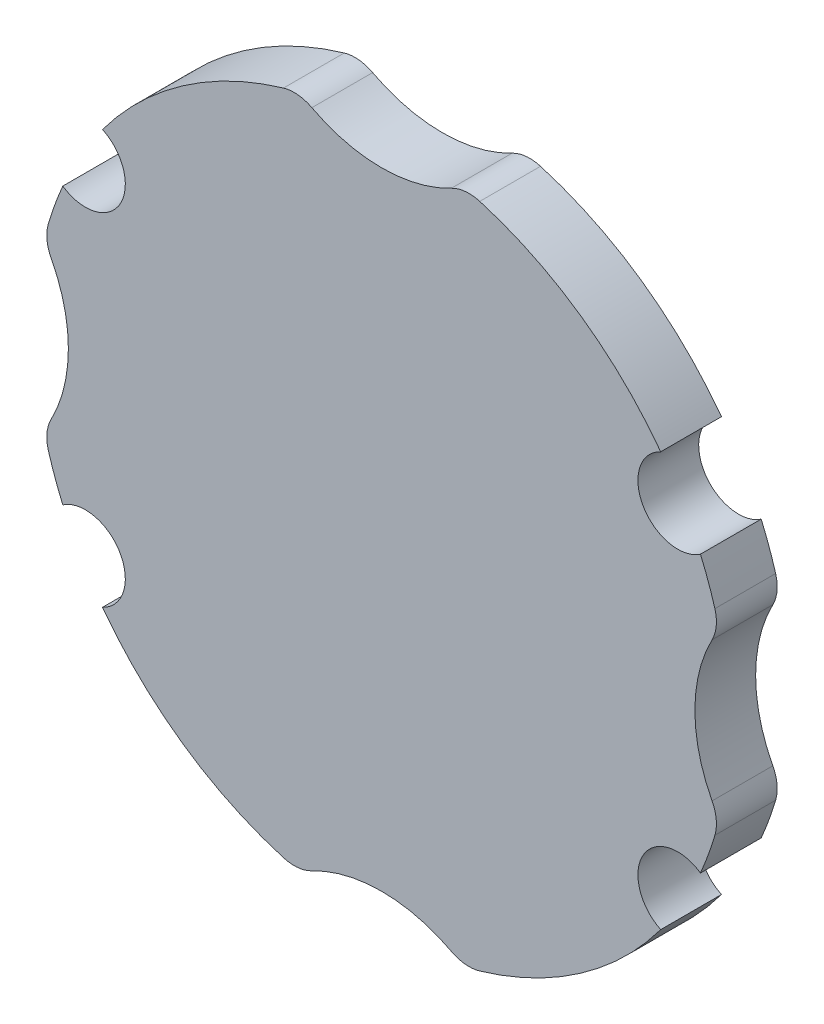
ISO-10303-21;
HEADER;
FILE_DESCRIPTION(('STEP AP214'),'2;1');
FILE_NAME('part.step','',(''),(''),'','','');
FILE_SCHEMA(('AUTOMOTIVE_DESIGN { 1 0 10303 214 1 1 1 1 }'));
ENDSEC;
DATA;
#1=APPLICATION_CONTEXT('core data for automotive mechanical design processes');
#2=APPLICATION_PROTOCOL_DEFINITION('international standard','automotive_design',2000,#1);
#3=PRODUCT_CONTEXT('',#1,'mechanical');
#4=PRODUCT('Part','Part','',(#3));
#5=PRODUCT_RELATED_PRODUCT_CATEGORY('part','',(#4));
#6=PRODUCT_DEFINITION_FORMATION('','',#4);
#7=PRODUCT_DEFINITION_CONTEXT('part definition',#1,'design');
#8=PRODUCT_DEFINITION('design','',#6,#7);
#9=PRODUCT_DEFINITION_SHAPE('','',#8);
#10=(LENGTH_UNIT() NAMED_UNIT(*) SI_UNIT(.MILLI.,.METRE.));
#11=(NAMED_UNIT(*) PLANE_ANGLE_UNIT() SI_UNIT($,.RADIAN.));
#12=(NAMED_UNIT(*) SI_UNIT($,.STERADIAN.) SOLID_ANGLE_UNIT());
#13=UNCERTAINTY_MEASURE_WITH_UNIT(LENGTH_MEASURE(1.E-05),#10,'distance_accuracy_value','');
#14=(GEOMETRIC_REPRESENTATION_CONTEXT(3) GLOBAL_UNCERTAINTY_ASSIGNED_CONTEXT((#13)) GLOBAL_UNIT_ASSIGNED_CONTEXT((#10,
#11,#12)) REPRESENTATION_CONTEXT('',''));
#15=CARTESIAN_POINT('',(0.,0.,0.));
#16=DIRECTION('',(0.,0.,1.));
#17=DIRECTION('',(1.,0.,0.));
#18=AXIS2_PLACEMENT_3D('',#15,#16,#17);
#19=CARTESIAN_POINT('',(0.,0.,1.6));
#20=DIRECTION('',(0.,0.,-1.));
#21=DIRECTION('',(-1.,0.,0.));
#22=AXIS2_PLACEMENT_3D('',#19,#20,#21);
#23=CYLINDRICAL_SURFACE('',#22,9.15);
#24=CARTESIAN_POINT('',(0.,0.,0.));
#25=DIRECTION('',(0.,0.,1.));
#26=DIRECTION('',(1.,0.,0.));
#27=AXIS2_PLACEMENT_3D('',#24,#25,#26);
#28=CIRCLE('',#27,9.15);
#29=CARTESIAN_POINT('',(2.58485859193619,-8.77730061349693,0.));
#30=VERTEX_POINT('',#29);
#31=CARTESIAN_POINT('',(7.35059652423199,-5.44896602466456,0.));
#32=VERTEX_POINT('',#31);
#33=EDGE_CURVE('E224',#30,#32,#28,.T.);
#34=ORIENTED_EDGE('',*,*,#33,.T.);
#35=DIRECTION('',(0.,0.,1.));
#36=VECTOR('',#35,1.);
#37=CARTESIAN_POINT('',(7.35059652423199,-5.44896602466455,0.8));
#38=LINE('',#37,#36);
#39=CARTESIAN_POINT('',(7.35059652423199,-5.44896602466455,1.6));
#40=VERTEX_POINT('',#39);
#41=EDGE_CURVE('E52',#32,#40,#38,.T.);
#42=ORIENTED_EDGE('',*,*,#41,.T.);
#43=CARTESIAN_POINT('',(0.,0.,1.6));
#44=DIRECTION('',(0.,0.,1.));
#45=DIRECTION('',(1.,0.,0.));
#46=AXIS2_PLACEMENT_3D('',#43,#44,#45);
#47=CIRCLE('',#46,9.15);
#48=CARTESIAN_POINT('',(2.58485859193619,-8.77730061349693,1.6));
#49=VERTEX_POINT('',#48);
#50=EDGE_CURVE('E352',#49,#40,#47,.T.);
#51=ORIENTED_EDGE('',*,*,#50,.F.);
#52=DIRECTION('',(0.,0.,-1.));
#53=VECTOR('',#52,1.);
#54=CARTESIAN_POINT('',(2.5848585919362,-8.77730061349693,1.6));
#55=LINE('',#54,#53);
#56=EDGE_CURVE('E314',#49,#30,#55,.T.);
#57=ORIENTED_EDGE('',*,*,#56,.T.);
#58=EDGE_LOOP('',(#34,#42,#51,#57));
#59=FACE_BOUND('',#58,.T.);
#60=ADVANCED_FACE('F37',(#59),#23,.T.);
#61=CARTESIAN_POINT('',(0.,0.,1.6));
#62=DIRECTION('',(0.,0.,-1.));
#63=DIRECTION('',(-1.,0.,0.));
#64=AXIS2_PLACEMENT_3D('',#61,#62,#63);
#65=CYLINDRICAL_SURFACE('',#64,9.15);
#66=CARTESIAN_POINT('',(0.,0.,0.));
#67=DIRECTION('',(0.,0.,1.));
#68=DIRECTION('',(1.,0.,0.));
#69=AXIS2_PLACEMENT_3D('',#66,#67,#68);
#70=CIRCLE('',#69,9.15);
#71=CARTESIAN_POINT('',(8.77730061349691,2.58485859193629,0.));
#72=VERTEX_POINT('',#71);
#73=CARTESIAN_POINT('',(8.39657328708877,3.6359396357128,0.));
#74=VERTEX_POINT('',#73);
#75=EDGE_CURVE('E219',#72,#74,#70,.T.);
#76=ORIENTED_EDGE('',*,*,#75,.T.);
#77=DIRECTION('',(0.,0.,1.));
#78=VECTOR('',#77,1.);
#79=CARTESIAN_POINT('',(8.39657328708876,3.63593963571281,0.8));
#80=LINE('',#79,#78);
#81=CARTESIAN_POINT('',(8.39657328708876,3.63593963571281,1.6));
#82=VERTEX_POINT('',#81);
#83=EDGE_CURVE('E60',#74,#82,#80,.T.);
#84=ORIENTED_EDGE('',*,*,#83,.T.);
#85=CARTESIAN_POINT('',(0.,0.,1.6));
#86=DIRECTION('',(0.,0.,1.));
#87=DIRECTION('',(1.,0.,0.));
#88=AXIS2_PLACEMENT_3D('',#85,#86,#87);
#89=CIRCLE('',#88,9.15);
#90=CARTESIAN_POINT('',(8.77730061349691,2.58485859193629,1.6));
#91=VERTEX_POINT('',#90);
#92=EDGE_CURVE('E346',#91,#82,#89,.T.);
#93=ORIENTED_EDGE('',*,*,#92,.F.);
#94=DIRECTION('',(0.,0.,-1.));
#95=VECTOR('',#94,1.);
#96=CARTESIAN_POINT('',(8.77730061349691,2.58485859193629,1.6));
#97=LINE('',#96,#95);
#98=EDGE_CURVE('E306',#91,#72,#97,.T.);
#99=ORIENTED_EDGE('',*,*,#98,.T.);
#100=EDGE_LOOP('',(#76,#84,#93,#99));
#101=FACE_BOUND('',#100,.T.);
#102=ADVANCED_FACE('F405',(#101),#65,.T.);
#103=CARTESIAN_POINT('',(0.,0.,1.6));
#104=DIRECTION('',(0.,0.,-1.));
#105=DIRECTION('',(-1.,0.,0.));
#106=AXIS2_PLACEMENT_3D('',#103,#104,#105);
#107=CYLINDRICAL_SURFACE('',#106,9.15);
#108=CARTESIAN_POINT('',(0.,0.,0.));
#109=DIRECTION('',(0.,0.,1.));
#110=DIRECTION('',(1.,0.,0.));
#111=AXIS2_PLACEMENT_3D('',#108,#109,#110);
#112=CIRCLE('',#111,9.15);
#113=CARTESIAN_POINT('',(-2.58485859193619,8.77730061349693,0.));
#114=VERTEX_POINT('',#113);
#115=CARTESIAN_POINT('',(-7.35059652423199,5.44896602466456,0.));
#116=VERTEX_POINT('',#115);
#117=EDGE_CURVE('E231',#114,#116,#112,.T.);
#118=ORIENTED_EDGE('',*,*,#117,.T.);
#119=DIRECTION('',(0.,0.,1.));
#120=VECTOR('',#119,1.);
#121=CARTESIAN_POINT('',(-7.35059652423199,5.44896602466455,0.8));
#122=LINE('',#121,#120);
#123=CARTESIAN_POINT('',(-7.35059652423199,5.44896602466455,1.6));
#124=VERTEX_POINT('',#123);
#125=EDGE_CURVE('E332',#116,#124,#122,.T.);
#126=ORIENTED_EDGE('',*,*,#125,.T.);
#127=CARTESIAN_POINT('',(0.,0.,1.6));
#128=DIRECTION('',(0.,0.,1.));
#129=DIRECTION('',(1.,0.,0.));
#130=AXIS2_PLACEMENT_3D('',#127,#128,#129);
#131=CIRCLE('',#130,9.15);
#132=CARTESIAN_POINT('',(-2.58485859193619,8.77730061349693,1.6));
#133=VERTEX_POINT('',#132);
#134=EDGE_CURVE('E339',#133,#124,#131,.T.);
#135=ORIENTED_EDGE('',*,*,#134,.F.);
#136=DIRECTION('',(0.,0.,-1.));
#137=VECTOR('',#136,1.);
#138=CARTESIAN_POINT('',(-2.58485859193619,8.77730061349693,1.6));
#139=LINE('',#138,#137);
#140=EDGE_CURVE('E293',#133,#114,#139,.T.);
#141=ORIENTED_EDGE('',*,*,#140,.T.);
#142=EDGE_LOOP('',(#118,#126,#135,#141));
#143=FACE_BOUND('',#142,.T.);
#144=ADVANCED_FACE('F407',(#143),#107,.T.);
#145=CARTESIAN_POINT('',(0.,0.,1.6));
#146=DIRECTION('',(0.,0.,-1.));
#147=DIRECTION('',(-1.,0.,0.));
#148=AXIS2_PLACEMENT_3D('',#145,#146,#147);
#149=CYLINDRICAL_SURFACE('',#148,9.15);
#150=CARTESIAN_POINT('',(0.,0.,0.));
#151=DIRECTION('',(0.,0.,1.));
#152=DIRECTION('',(1.,0.,0.));
#153=AXIS2_PLACEMENT_3D('',#150,#151,#152);
#154=CIRCLE('',#153,9.15);
#155=CARTESIAN_POINT('',(-8.77730061349692,-2.58485859193623,0.));
#156=VERTEX_POINT('',#155);
#157=CARTESIAN_POINT('',(-8.39657328708876,-3.63593963571282,0.));
#158=VERTEX_POINT('',#157);
#159=EDGE_CURVE('E238',#156,#158,#154,.T.);
#160=ORIENTED_EDGE('',*,*,#159,.T.);
#161=DIRECTION('',(0.,0.,1.));
#162=VECTOR('',#161,1.);
#163=CARTESIAN_POINT('',(-8.39657328708877,-3.63593963571281,0.8));
#164=LINE('',#163,#162);
#165=CARTESIAN_POINT('',(-8.39657328708877,-3.63593963571281,1.6));
#166=VERTEX_POINT('',#165);
#167=EDGE_CURVE('E362',#158,#166,#164,.T.);
#168=ORIENTED_EDGE('',*,*,#167,.T.);
#169=CARTESIAN_POINT('',(0.,0.,1.6));
#170=DIRECTION('',(0.,0.,1.));
#171=DIRECTION('',(1.,0.,0.));
#172=AXIS2_PLACEMENT_3D('',#169,#170,#171);
#173=CIRCLE('',#172,9.15);
#174=CARTESIAN_POINT('',(-8.77730061349692,-2.58485859193623,1.6));
#175=VERTEX_POINT('',#174);
#176=EDGE_CURVE('E245',#175,#166,#173,.T.);
#177=ORIENTED_EDGE('',*,*,#176,.F.);
#178=DIRECTION('',(0.,0.,-1.));
#179=VECTOR('',#178,1.);
#180=CARTESIAN_POINT('',(-8.77730061349692,-2.58485859193623,1.6));
#181=LINE('',#180,#179);
#182=EDGE_CURVE('E266',#175,#156,#181,.T.);
#183=ORIENTED_EDGE('',*,*,#182,.T.);
#184=EDGE_LOOP('',(#160,#168,#177,#183));
#185=FACE_BOUND('',#184,.T.);
#186=ADVANCED_FACE('F413',(#185),#149,.T.);
#187=CARTESIAN_POINT('',(0.,-12.2,1.6));
#188=DIRECTION('',(0.,0.,-1.));
#189=DIRECTION('',(-1.,0.,0.));
#190=AXIS2_PLACEMENT_3D('',#187,#188,#189);
#191=CYLINDRICAL_SURFACE('',#190,3.95);
#192=CARTESIAN_POINT('',(0.,-12.2,1.6));
#193=DIRECTION('',(0.,0.,-1.));
#194=DIRECTION('',(1.,0.,0.));
#195=AXIS2_PLACEMENT_3D('',#192,#193,#194);
#196=CIRCLE('',#195,3.95);
#197=CARTESIAN_POINT('',(-1.83723707503242,-8.70327868852459,1.6));
#198=VERTEX_POINT('',#197);
#199=CARTESIAN_POINT('',(1.83723707503242,-8.70327868852459,1.6));
#200=VERTEX_POINT('',#199);
#201=EDGE_CURVE('E241',#198,#200,#196,.T.);
#202=ORIENTED_EDGE('',*,*,#201,.F.);
#203=DIRECTION('',(0.,0.,-1.));
#204=VECTOR('',#203,1.);
#205=CARTESIAN_POINT('',(-1.83723707503242,-8.70327868852459,1.6));
#206=LINE('',#205,#204);
#207=CARTESIAN_POINT('',(-1.83723707503242,-8.70327868852459,0.));
#208=VERTEX_POINT('',#207);
#209=EDGE_CURVE('E244',#198,#208,#206,.T.);
#210=ORIENTED_EDGE('',*,*,#209,.T.);
#211=CARTESIAN_POINT('',(0.,-12.2,0.));
#212=DIRECTION('',(0.,0.,-1.));
#213=DIRECTION('',(1.,0.,0.));
#214=AXIS2_PLACEMENT_3D('',#211,#212,#213);
#215=CIRCLE('',#214,3.95);
#216=CARTESIAN_POINT('',(1.83723707503242,-8.70327868852459,0.));
#217=VERTEX_POINT('',#216);
#218=EDGE_CURVE('E328',#208,#217,#215,.T.);
#219=ORIENTED_EDGE('',*,*,#218,.T.);
#220=DIRECTION('',(0.,0.,-1.));
#221=VECTOR('',#220,1.);
#222=CARTESIAN_POINT('',(1.83723707503242,-8.70327868852459,1.6));
#223=LINE('',#222,#221);
#224=EDGE_CURVE('E242',#217,#200,#223,.F.);
#225=ORIENTED_EDGE('',*,*,#224,.T.);
#226=EDGE_LOOP('',(#202,#210,#219,#225));
#227=FACE_BOUND('',#226,.T.);
#228=ADVANCED_FACE('F430',(#227),#191,.F.);
#229=CARTESIAN_POINT('',(8.39657328708876,-3.63593963571281,1.6));
#230=VERTEX_POINT('',#229);
#231=CARTESIAN_POINT('',(8.77730061349696,-2.5848585919361,1.6));
#232=VERTEX_POINT('',#231);
#233=EDGE_CURVE('E354',#230,#232,#47,.T.);
#234=ORIENTED_EDGE('',*,*,#233,.F.);
#235=DIRECTION('',(0.,0.,1.));
#236=VECTOR('',#235,1.);
#237=CARTESIAN_POINT('',(8.39657328708876,-3.63593963571281,0.8));
#238=LINE('',#237,#236);
#239=CARTESIAN_POINT('',(8.39657328708876,-3.63593963571281,0.));
#240=VERTEX_POINT('',#239);
#241=EDGE_CURVE('E369',#230,#240,#238,.F.);
#242=ORIENTED_EDGE('',*,*,#241,.T.);
#243=CARTESIAN_POINT('',(8.77730061349696,-2.5848585919361,0.));
#244=VERTEX_POINT('',#243);
#245=EDGE_CURVE('E322',#240,#244,#28,.T.);
#246=ORIENTED_EDGE('',*,*,#245,.T.);
#247=DIRECTION('',(0.,0.,-1.));
#248=VECTOR('',#247,1.);
#249=CARTESIAN_POINT('',(8.77730061349696,-2.5848585919361,1.6));
#250=LINE('',#249,#248);
#251=EDGE_CURVE('E317',#244,#232,#250,.F.);
#252=ORIENTED_EDGE('',*,*,#251,.T.);
#253=EDGE_LOOP('',(#234,#242,#246,#252));
#254=FACE_BOUND('',#253,.T.);
#255=ADVANCED_FACE('F388',(#254),#23,.T.);
#256=CARTESIAN_POINT('',(12.2,1.27788217001659E-13,1.6));
#257=DIRECTION('',(0.,0.,-1.));
#258=DIRECTION('',(-1.,0.,0.));
#259=AXIS2_PLACEMENT_3D('',#256,#257,#258);
#260=CYLINDRICAL_SURFACE('',#259,3.95);
#261=CARTESIAN_POINT('',(12.2,1.27788217001659E-13,0.));
#262=DIRECTION('',(0.,0.,-1.));
#263=DIRECTION('',(1.,0.,0.));
#264=AXIS2_PLACEMENT_3D('',#261,#262,#263);
#265=CIRCLE('',#264,3.95);
#266=CARTESIAN_POINT('',(8.70327868852461,-1.83723707503233,0.));
#267=VERTEX_POINT('',#266);
#268=CARTESIAN_POINT('',(8.70327868852457,1.83723707503251,0.));
#269=VERTEX_POINT('',#268);
#270=EDGE_CURVE('E220',#267,#269,#265,.T.);
#271=ORIENTED_EDGE('',*,*,#270,.T.);
#272=DIRECTION('',(0.,0.,-1.));
#273=VECTOR('',#272,1.);
#274=CARTESIAN_POINT('',(8.70327868852457,1.83723707503251,1.6));
#275=LINE('',#274,#273);
#276=CARTESIAN_POINT('',(8.70327868852457,1.83723707503251,1.6));
#277=VERTEX_POINT('',#276);
#278=EDGE_CURVE('E312',#269,#277,#275,.F.);
#279=ORIENTED_EDGE('',*,*,#278,.T.);
#280=CARTESIAN_POINT('',(12.2,1.27788217001659E-13,1.6));
#281=DIRECTION('',(0.,0.,-1.));
#282=DIRECTION('',(1.,0.,0.));
#283=AXIS2_PLACEMENT_3D('',#280,#281,#282);
#284=CIRCLE('',#283,3.95);
#285=CARTESIAN_POINT('',(8.70327868852461,-1.83723707503233,1.6));
#286=VERTEX_POINT('',#285);
#287=EDGE_CURVE('E349',#286,#277,#284,.T.);
#288=ORIENTED_EDGE('',*,*,#287,.F.);
#289=DIRECTION('',(0.,0.,-1.));
#290=VECTOR('',#289,1.);
#291=CARTESIAN_POINT('',(8.70327868852461,-1.83723707503233,1.6));
#292=LINE('',#291,#290);
#293=EDGE_CURVE('E309',#286,#267,#292,.T.);
#294=ORIENTED_EDGE('',*,*,#293,.T.);
#295=EDGE_LOOP('',(#271,#279,#288,#294));
#296=FACE_BOUND('',#295,.T.);
#297=ADVANCED_FACE('F397',(#296),#260,.F.);
#298=CARTESIAN_POINT('',(7.35059652423199,5.44896602466455,1.6));
#299=VERTEX_POINT('',#298);
#300=CARTESIAN_POINT('',(2.58485859193619,8.77730061349693,1.6));
#301=VERTEX_POINT('',#300);
#302=EDGE_CURVE('E212',#299,#301,#89,.T.);
#303=ORIENTED_EDGE('',*,*,#302,.F.);
#304=DIRECTION('',(0.,0.,1.));
#305=VECTOR('',#304,1.);
#306=CARTESIAN_POINT('',(7.35059652423199,5.44896602466455,0.8));
#307=LINE('',#306,#305);
#308=CARTESIAN_POINT('',(7.35059652423199,5.44896602466455,0.));
#309=VERTEX_POINT('',#308);
#310=EDGE_CURVE('E198',#299,#309,#307,.F.);
#311=ORIENTED_EDGE('',*,*,#310,.T.);
#312=CARTESIAN_POINT('',(2.58485859193619,8.77730061349693,0.));
#313=VERTEX_POINT('',#312);
#314=EDGE_CURVE('E210',#309,#313,#70,.T.);
#315=ORIENTED_EDGE('',*,*,#314,.T.);
#316=DIRECTION('',(0.,0.,-1.));
#317=VECTOR('',#316,1.);
#318=CARTESIAN_POINT('',(2.58485859193619,8.77730061349693,1.6));
#319=LINE('',#318,#317);
#320=EDGE_CURVE('E304',#313,#301,#319,.F.);
#321=ORIENTED_EDGE('',*,*,#320,.T.);
#322=EDGE_LOOP('',(#303,#311,#315,#321));
#323=FACE_BOUND('',#322,.T.);
#324=ADVANCED_FACE('F208',(#323),#65,.T.);
#325=CARTESIAN_POINT('',(0.,12.2,1.6));
#326=DIRECTION('',(0.,0.,-1.));
#327=DIRECTION('',(-1.,0.,0.));
#328=AXIS2_PLACEMENT_3D('',#325,#326,#327);
#329=CYLINDRICAL_SURFACE('',#328,3.95);
#330=CARTESIAN_POINT('',(0.,12.2,0.));
#331=DIRECTION('',(0.,0.,-1.));
#332=DIRECTION('',(1.,0.,0.));
#333=AXIS2_PLACEMENT_3D('',#330,#331,#332);
#334=CIRCLE('',#333,3.95);
#335=CARTESIAN_POINT('',(1.83723707503242,8.70327868852459,0.));
#336=VERTEX_POINT('',#335);
#337=CARTESIAN_POINT('',(-1.83723707503242,8.70327868852459,0.));
#338=VERTEX_POINT('',#337);
#339=EDGE_CURVE('E222',#336,#338,#334,.T.);
#340=ORIENTED_EDGE('',*,*,#339,.T.);
#341=DIRECTION('',(0.,0.,-1.));
#342=VECTOR('',#341,1.);
#343=CARTESIAN_POINT('',(-1.83723707503242,8.70327868852459,1.6));
#344=LINE('',#343,#342);
#345=CARTESIAN_POINT('',(-1.83723707503242,8.70327868852459,1.6));
#346=VERTEX_POINT('',#345);
#347=EDGE_CURVE('E302',#338,#346,#344,.F.);
#348=ORIENTED_EDGE('',*,*,#347,.T.);
#349=CARTESIAN_POINT('',(0.,12.2,1.6));
#350=DIRECTION('',(0.,0.,-1.));
#351=DIRECTION('',(1.,0.,0.));
#352=AXIS2_PLACEMENT_3D('',#349,#350,#351);
#353=CIRCLE('',#352,3.95);
#354=CARTESIAN_POINT('',(1.83723707503242,8.70327868852459,1.6));
#355=VERTEX_POINT('',#354);
#356=EDGE_CURVE('E343',#355,#346,#353,.T.);
#357=ORIENTED_EDGE('',*,*,#356,.F.);
#358=DIRECTION('',(0.,0.,-1.));
#359=VECTOR('',#358,1.);
#360=CARTESIAN_POINT('',(1.83723707503242,8.70327868852459,1.6));
#361=LINE('',#360,#359);
#362=EDGE_CURVE('E299',#355,#336,#361,.T.);
#363=ORIENTED_EDGE('',*,*,#362,.T.);
#364=EDGE_LOOP('',(#340,#348,#357,#363));
#365=FACE_BOUND('',#364,.T.);
#366=ADVANCED_FACE('F421',(#365),#329,.F.);
#367=CARTESIAN_POINT('',(-8.39657328708876,3.63593963571281,1.6));
#368=VERTEX_POINT('',#367);
#369=CARTESIAN_POINT('',(-8.77730061349694,2.58485859193616,1.6));
#370=VERTEX_POINT('',#369);
#371=EDGE_CURVE('E342',#368,#370,#131,.T.);
#372=ORIENTED_EDGE('',*,*,#371,.F.);
#373=DIRECTION('',(0.,0.,1.));
#374=VECTOR('',#373,1.);
#375=CARTESIAN_POINT('',(-8.39657328708876,3.63593963571281,0.8));
#376=LINE('',#375,#374);
#377=CARTESIAN_POINT('',(-8.39657328708876,3.63593963571281,0.));
#378=VERTEX_POINT('',#377);
#379=EDGE_CURVE('E359',#368,#378,#376,.F.);
#380=ORIENTED_EDGE('',*,*,#379,.T.);
#381=CARTESIAN_POINT('',(-8.77730061349694,2.58485859193616,0.));
#382=VERTEX_POINT('',#381);
#383=EDGE_CURVE('E230',#378,#382,#112,.T.);
#384=ORIENTED_EDGE('',*,*,#383,.T.);
#385=DIRECTION('',(0.,0.,-1.));
#386=VECTOR('',#385,1.);
#387=CARTESIAN_POINT('',(-8.77730061349694,2.58485859193616,1.6));
#388=LINE('',#387,#386);
#389=EDGE_CURVE('E296',#382,#370,#388,.F.);
#390=ORIENTED_EDGE('',*,*,#389,.T.);
#391=EDGE_LOOP('',(#372,#380,#384,#390));
#392=FACE_BOUND('',#391,.T.);
#393=ADVANCED_FACE('F416',(#392),#107,.T.);
#394=CARTESIAN_POINT('',(-12.2,0.,1.6));
#395=DIRECTION('',(0.,0.,-1.));
#396=DIRECTION('',(-1.,0.,0.));
#397=AXIS2_PLACEMENT_3D('',#394,#395,#396);
#398=CYLINDRICAL_SURFACE('',#397,3.95);
#399=CARTESIAN_POINT('',(-12.2,0.,0.));
#400=DIRECTION('',(0.,0.,-1.));
#401=DIRECTION('',(1.,0.,0.));
#402=AXIS2_PLACEMENT_3D('',#399,#400,#401);
#403=CIRCLE('',#402,3.95);
#404=CARTESIAN_POINT('',(-8.70327868852459,1.83723707503239,0.));
#405=VERTEX_POINT('',#404);
#406=CARTESIAN_POINT('',(-8.70327868852458,-1.83723707503245,0.));
#407=VERTEX_POINT('',#406);
#408=EDGE_CURVE('E234',#405,#407,#403,.T.);
#409=ORIENTED_EDGE('',*,*,#408,.T.);
#410=DIRECTION('',(0.,0.,-1.));
#411=VECTOR('',#410,1.);
#412=CARTESIAN_POINT('',(-8.70327868852458,-1.83723707503245,1.6));
#413=LINE('',#412,#411);
#414=CARTESIAN_POINT('',(-8.70327868852458,-1.83723707503245,1.6));
#415=VERTEX_POINT('',#414);
#416=EDGE_CURVE('E291',#407,#415,#413,.F.);
#417=ORIENTED_EDGE('',*,*,#416,.T.);
#418=CARTESIAN_POINT('',(-12.2,0.,1.6));
#419=DIRECTION('',(0.,0.,-1.));
#420=DIRECTION('',(1.,0.,0.));
#421=AXIS2_PLACEMENT_3D('',#418,#419,#420);
#422=CIRCLE('',#421,3.95);
#423=CARTESIAN_POINT('',(-8.70327868852459,1.83723707503239,1.6));
#424=VERTEX_POINT('',#423);
#425=EDGE_CURVE('E336',#424,#415,#422,.T.);
#426=ORIENTED_EDGE('',*,*,#425,.F.);
#427=DIRECTION('',(0.,0.,-1.));
#428=VECTOR('',#427,1.);
#429=CARTESIAN_POINT('',(-8.70327868852459,1.83723707503239,1.6));
#430=LINE('',#429,#428);
#431=EDGE_CURVE('E288',#424,#405,#430,.T.);
#432=ORIENTED_EDGE('',*,*,#431,.T.);
#433=EDGE_LOOP('',(#409,#417,#426,#432));
#434=FACE_BOUND('',#433,.T.);
#435=ADVANCED_FACE('F483',(#434),#398,.F.);
#436=CARTESIAN_POINT('',(-7.35059652423199,-5.44896602466455,1.6));
#437=VERTEX_POINT('',#436);
#438=CARTESIAN_POINT('',(-2.5848585919362,-8.77730061349693,1.6));
#439=VERTEX_POINT('',#438);
#440=EDGE_CURVE('E335',#437,#439,#173,.T.);
#441=ORIENTED_EDGE('',*,*,#440,.F.);
#442=DIRECTION('',(0.,0.,1.));
#443=VECTOR('',#442,1.);
#444=CARTESIAN_POINT('',(-7.35059652423199,-5.44896602466455,0.8));
#445=LINE('',#444,#443);
#446=CARTESIAN_POINT('',(-7.35059652423199,-5.44896602466455,0.));
#447=VERTEX_POINT('',#446);
#448=EDGE_CURVE('E365',#437,#447,#445,.F.);
#449=ORIENTED_EDGE('',*,*,#448,.T.);
#450=CARTESIAN_POINT('',(-2.5848585919362,-8.77730061349693,0.));
#451=VERTEX_POINT('',#450);
#452=EDGE_CURVE('E237',#447,#451,#154,.T.);
#453=ORIENTED_EDGE('',*,*,#452,.T.);
#454=DIRECTION('',(0.,0.,-1.));
#455=VECTOR('',#454,1.);
#456=CARTESIAN_POINT('',(-2.5848585919362,-8.77730061349693,1.6));
#457=LINE('',#456,#455);
#458=EDGE_CURVE('E269',#451,#439,#457,.F.);
#459=ORIENTED_EDGE('',*,*,#458,.T.);
#460=EDGE_LOOP('',(#441,#449,#453,#459));
#461=FACE_BOUND('',#460,.T.);
#462=ADVANCED_FACE('F472',(#461),#149,.T.);
#463=CARTESIAN_POINT('',(0.,-6.1,1.6));
#464=DIRECTION('',(0.,0.,1.));
#465=DIRECTION('',(1.,0.,0.));
#466=AXIS2_PLACEMENT_3D('',#463,#464,#465);
#467=PLANE('',#466);
#468=CARTESIAN_POINT('',(-7.8,4.5,1.6));
#469=DIRECTION('',(0.,0.,1.));
#470=DIRECTION('',(-1.,0.,0.));
#471=AXIS2_PLACEMENT_3D('',#468,#469,#470);
#472=CIRCLE('',#471,1.05);
#473=EDGE_CURVE('E374',#368,#124,#472,.T.);
#474=ORIENTED_EDGE('',*,*,#473,.F.);
#475=ORIENTED_EDGE('',*,*,#371,.T.);
#476=CARTESIAN_POINT('',(-7.81803278688525,2.30236038516718,1.6));
#477=DIRECTION('',(0.,0.,1.));
#478=DIRECTION('',(1.,0.,0.));
#479=AXIS2_PLACEMENT_3D('',#476,#477,#478);
#480=CIRCLE('',#479,1.);
#481=EDGE_CURVE('E282',#370,#424,#480,.T.);
#482=ORIENTED_EDGE('',*,*,#481,.T.);
#483=ORIENTED_EDGE('',*,*,#425,.T.);
#484=CARTESIAN_POINT('',(-7.81803278688524,-2.30236038516724,1.6));
#485=DIRECTION('',(0.,0.,1.));
#486=DIRECTION('',(1.,0.,0.));
#487=AXIS2_PLACEMENT_3D('',#484,#485,#486);
#488=CIRCLE('',#487,1.);
#489=EDGE_CURVE('E284',#415,#175,#488,.T.);
#490=ORIENTED_EDGE('',*,*,#489,.T.);
#491=ORIENTED_EDGE('',*,*,#176,.T.);
#492=CARTESIAN_POINT('',(-7.8,-4.5,1.6));
#493=DIRECTION('',(0.,0.,1.));
#494=DIRECTION('',(1.,0.,0.));
#495=AXIS2_PLACEMENT_3D('',#492,#493,#494);
#496=CIRCLE('',#495,1.05);
#497=EDGE_CURVE('E379',#437,#166,#496,.T.);
#498=ORIENTED_EDGE('',*,*,#497,.F.);
#499=ORIENTED_EDGE('',*,*,#440,.T.);
#500=CARTESIAN_POINT('',(-2.30236038516722,-7.81803278688525,1.6));
#501=DIRECTION('',(0.,0.,1.));
#502=DIRECTION('',(1.,0.,0.));
#503=AXIS2_PLACEMENT_3D('',#500,#501,#502);
#504=CIRCLE('',#503,1.);
#505=EDGE_CURVE('E286',#439,#198,#504,.T.);
#506=ORIENTED_EDGE('',*,*,#505,.T.);
#507=ORIENTED_EDGE('',*,*,#201,.T.);
#508=CARTESIAN_POINT('',(2.30236038516721,-7.81803278688524,1.6));
#509=DIRECTION('',(0.,0.,1.));
#510=DIRECTION('',(1.,0.,0.));
#511=AXIS2_PLACEMENT_3D('',#508,#509,#510);
#512=CIRCLE('',#511,1.);
#513=EDGE_CURVE('E274',#200,#49,#512,.T.);
#514=ORIENTED_EDGE('',*,*,#513,.T.);
#515=ORIENTED_EDGE('',*,*,#50,.T.);
#516=CARTESIAN_POINT('',(7.8,-4.5,1.6));
#517=DIRECTION('',(0.,0.,1.));
#518=DIRECTION('',(-1.,0.,0.));
#519=AXIS2_PLACEMENT_3D('',#516,#517,#518);
#520=CIRCLE('',#519,1.05);
#521=EDGE_CURVE('E372',#230,#40,#520,.T.);
#522=ORIENTED_EDGE('',*,*,#521,.F.);
#523=ORIENTED_EDGE('',*,*,#233,.T.);
#524=CARTESIAN_POINT('',(7.81803278688527,-2.30236038516713,1.6));
#525=DIRECTION('',(0.,0.,1.));
#526=DIRECTION('',(1.,0.,0.));
#527=AXIS2_PLACEMENT_3D('',#524,#525,#526);
#528=CIRCLE('',#527,1.);
#529=EDGE_CURVE('E276',#232,#286,#528,.T.);
#530=ORIENTED_EDGE('',*,*,#529,.T.);
#531=ORIENTED_EDGE('',*,*,#287,.T.);
#532=CARTESIAN_POINT('',(7.81803278688522,2.30236038516729,1.6));
#533=DIRECTION('',(0.,0.,1.));
#534=DIRECTION('',(1.,0.,0.));
#535=AXIS2_PLACEMENT_3D('',#532,#533,#534);
#536=CIRCLE('',#535,1.);
#537=EDGE_CURVE('E278',#277,#91,#536,.T.);
#538=ORIENTED_EDGE('',*,*,#537,.T.);
#539=ORIENTED_EDGE('',*,*,#92,.T.);
#540=CARTESIAN_POINT('',(7.8,4.5,1.6));
#541=DIRECTION('',(0.,0.,1.));
#542=DIRECTION('',(1.,0.,0.));
#543=AXIS2_PLACEMENT_3D('',#540,#541,#542);
#544=CIRCLE('',#543,1.05);
#545=EDGE_CURVE('E204',#299,#82,#544,.T.);
#546=ORIENTED_EDGE('',*,*,#545,.F.);
#547=ORIENTED_EDGE('',*,*,#302,.T.);
#548=CARTESIAN_POINT('',(2.30236038516721,7.81803278688524,1.6));
#549=DIRECTION('',(0.,0.,1.));
#550=DIRECTION('',(1.,0.,0.));
#551=AXIS2_PLACEMENT_3D('',#548,#549,#550);
#552=CIRCLE('',#551,1.);
#553=EDGE_CURVE('E272',#301,#355,#552,.T.);
#554=ORIENTED_EDGE('',*,*,#553,.T.);
#555=ORIENTED_EDGE('',*,*,#356,.T.);
#556=CARTESIAN_POINT('',(-2.30236038516721,7.81803278688525,1.6));
#557=DIRECTION('',(0.,0.,1.));
#558=DIRECTION('',(1.,0.,0.));
#559=AXIS2_PLACEMENT_3D('',#556,#557,#558);
#560=CIRCLE('',#559,1.);
#561=EDGE_CURVE('E280',#346,#133,#560,.T.);
#562=ORIENTED_EDGE('',*,*,#561,.T.);
#563=ORIENTED_EDGE('',*,*,#134,.T.);
#564=EDGE_LOOP('',(#474,#475,#482,#483,#490,#491,#498,#499,#506,#507,#514,#515,#522,#523,#530,
#531,#538,#539,#546,#547,#554,#555,#562,#563));
#565=FACE_BOUND('',#564,.T.);
#566=ADVANCED_FACE('F386',(#565),#467,.T.);
#567=CARTESIAN_POINT('',(0.,-6.1,0.));
#568=DIRECTION('',(0.,0.,1.));
#569=DIRECTION('',(1.,0.,0.));
#570=AXIS2_PLACEMENT_3D('',#567,#568,#569);
#571=PLANE('',#570);
#572=ORIENTED_EDGE('',*,*,#383,.F.);
#573=CARTESIAN_POINT('',(-7.8,4.5,0.));
#574=DIRECTION('',(0.,0.,1.));
#575=DIRECTION('',(-1.,0.,0.));
#576=AXIS2_PLACEMENT_3D('',#573,#574,#575);
#577=CIRCLE('',#576,1.05);
#578=EDGE_CURVE('E376',#378,#116,#577,.T.);
#579=ORIENTED_EDGE('',*,*,#578,.T.);
#580=ORIENTED_EDGE('',*,*,#117,.F.);
#581=CARTESIAN_POINT('',(-2.30236038516721,7.81803278688525,0.));
#582=DIRECTION('',(0.,0.,1.));
#583=DIRECTION('',(1.,0.,0.));
#584=AXIS2_PLACEMENT_3D('',#581,#582,#583);
#585=CIRCLE('',#584,1.);
#586=EDGE_CURVE('E256',#114,#338,#585,.F.);
#587=ORIENTED_EDGE('',*,*,#586,.T.);
#588=ORIENTED_EDGE('',*,*,#339,.F.);
#589=CARTESIAN_POINT('',(2.30236038516721,7.81803278688524,0.));
#590=DIRECTION('',(0.,0.,1.));
#591=DIRECTION('',(1.,0.,0.));
#592=AXIS2_PLACEMENT_3D('',#589,#590,#591);
#593=CIRCLE('',#592,1.);
#594=EDGE_CURVE('E217',#336,#313,#593,.F.);
#595=ORIENTED_EDGE('',*,*,#594,.T.);
#596=ORIENTED_EDGE('',*,*,#314,.F.);
#597=CARTESIAN_POINT('',(7.8,4.5,0.));
#598=DIRECTION('',(0.,0.,1.));
#599=DIRECTION('',(1.,0.,0.));
#600=AXIS2_PLACEMENT_3D('',#597,#598,#599);
#601=CIRCLE('',#600,1.05);
#602=EDGE_CURVE('E195',#309,#74,#601,.T.);
#603=ORIENTED_EDGE('',*,*,#602,.T.);
#604=ORIENTED_EDGE('',*,*,#75,.F.);
#605=CARTESIAN_POINT('',(7.81803278688522,2.30236038516729,0.));
#606=DIRECTION('',(0.,0.,1.));
#607=DIRECTION('',(1.,0.,0.));
#608=AXIS2_PLACEMENT_3D('',#605,#606,#607);
#609=CIRCLE('',#608,1.);
#610=EDGE_CURVE('E254',#72,#269,#609,.F.);
#611=ORIENTED_EDGE('',*,*,#610,.T.);
#612=ORIENTED_EDGE('',*,*,#270,.F.);
#613=CARTESIAN_POINT('',(7.81803278688527,-2.30236038516713,0.));
#614=DIRECTION('',(0.,0.,1.));
#615=DIRECTION('',(1.,0.,0.));
#616=AXIS2_PLACEMENT_3D('',#613,#614,#615);
#617=CIRCLE('',#616,1.);
#618=EDGE_CURVE('E251',#267,#244,#617,.F.);
#619=ORIENTED_EDGE('',*,*,#618,.T.);
#620=ORIENTED_EDGE('',*,*,#245,.F.);
#621=CARTESIAN_POINT('',(7.8,-4.5,0.));
#622=DIRECTION('',(0.,0.,1.));
#623=DIRECTION('',(1.,0.,0.));
#624=AXIS2_PLACEMENT_3D('',#621,#622,#623);
#625=CIRCLE('',#624,1.05);
#626=EDGE_CURVE('E45',#240,#32,#625,.T.);
#627=ORIENTED_EDGE('',*,*,#626,.T.);
#628=ORIENTED_EDGE('',*,*,#33,.F.);
#629=CARTESIAN_POINT('',(2.30236038516721,-7.81803278688524,0.));
#630=DIRECTION('',(0.,0.,1.));
#631=DIRECTION('',(1.,0.,0.));
#632=AXIS2_PLACEMENT_3D('',#629,#630,#631);
#633=CIRCLE('',#632,1.);
#634=EDGE_CURVE('E249',#30,#217,#633,.F.);
#635=ORIENTED_EDGE('',*,*,#634,.T.);
#636=ORIENTED_EDGE('',*,*,#218,.F.);
#637=CARTESIAN_POINT('',(-2.30236038516722,-7.81803278688525,0.));
#638=DIRECTION('',(0.,0.,1.));
#639=DIRECTION('',(1.,0.,0.));
#640=AXIS2_PLACEMENT_3D('',#637,#638,#639);
#641=CIRCLE('',#640,1.);
#642=EDGE_CURVE('E263',#208,#451,#641,.F.);
#643=ORIENTED_EDGE('',*,*,#642,.T.);
#644=ORIENTED_EDGE('',*,*,#452,.F.);
#645=CARTESIAN_POINT('',(-7.8,-4.5,0.));
#646=DIRECTION('',(0.,0.,1.));
#647=DIRECTION('',(1.,0.,0.));
#648=AXIS2_PLACEMENT_3D('',#645,#646,#647);
#649=CIRCLE('',#648,1.05);
#650=EDGE_CURVE('E11',#447,#158,#649,.T.);
#651=ORIENTED_EDGE('',*,*,#650,.T.);
#652=ORIENTED_EDGE('',*,*,#159,.F.);
#653=CARTESIAN_POINT('',(-7.81803278688524,-2.30236038516724,0.));
#654=DIRECTION('',(0.,0.,1.));
#655=DIRECTION('',(1.,0.,0.));
#656=AXIS2_PLACEMENT_3D('',#653,#654,#655);
#657=CIRCLE('',#656,1.);
#658=EDGE_CURVE('E261',#156,#407,#657,.F.);
#659=ORIENTED_EDGE('',*,*,#658,.T.);
#660=ORIENTED_EDGE('',*,*,#408,.F.);
#661=CARTESIAN_POINT('',(-7.81803278688525,2.30236038516718,0.));
#662=DIRECTION('',(0.,0.,1.));
#663=DIRECTION('',(1.,0.,0.));
#664=AXIS2_PLACEMENT_3D('',#661,#662,#663);
#665=CIRCLE('',#664,1.);
#666=EDGE_CURVE('E258',#405,#382,#665,.F.);
#667=ORIENTED_EDGE('',*,*,#666,.T.);
#668=EDGE_LOOP('',(#572,#579,#580,#587,#588,#595,#596,#603,#604,#611,#612,#619,#620,#627,#628,
#635,#636,#643,#644,#651,#652,#659,#660,#667));
#669=FACE_BOUND('',#668,.T.);
#670=ADVANCED_FACE('F215',(#669),#571,.F.);
#671=CARTESIAN_POINT('',(-2.30236038516722,-7.81803278688525,1.6));
#672=DIRECTION('',(0.,0.,1.));
#673=DIRECTION('',(1.,0.,0.));
#674=AXIS2_PLACEMENT_3D('',#671,#672,#673);
#675=CYLINDRICAL_SURFACE('',#674,1.);
#676=ORIENTED_EDGE('',*,*,#505,.F.);
#677=ORIENTED_EDGE('',*,*,#458,.F.);
#678=ORIENTED_EDGE('',*,*,#642,.F.);
#679=ORIENTED_EDGE('',*,*,#209,.F.);
#680=EDGE_LOOP('',(#676,#677,#678,#679));
#681=FACE_BOUND('',#680,.T.);
#682=ADVANCED_FACE('F435',(#681),#675,.T.);
#683=CARTESIAN_POINT('',(-7.81803278688524,-2.30236038516724,1.6));
#684=DIRECTION('',(0.,0.,1.));
#685=DIRECTION('',(1.,0.,0.));
#686=AXIS2_PLACEMENT_3D('',#683,#684,#685);
#687=CYLINDRICAL_SURFACE('',#686,1.);
#688=ORIENTED_EDGE('',*,*,#489,.F.);
#689=ORIENTED_EDGE('',*,*,#416,.F.);
#690=ORIENTED_EDGE('',*,*,#658,.F.);
#691=ORIENTED_EDGE('',*,*,#182,.F.);
#692=EDGE_LOOP('',(#688,#689,#690,#691));
#693=FACE_BOUND('',#692,.T.);
#694=ADVANCED_FACE('F438',(#693),#687,.T.);
#695=CARTESIAN_POINT('',(-7.81803278688525,2.30236038516718,1.6));
#696=DIRECTION('',(0.,0.,1.));
#697=DIRECTION('',(1.,0.,0.));
#698=AXIS2_PLACEMENT_3D('',#695,#696,#697);
#699=CYLINDRICAL_SURFACE('',#698,1.);
#700=ORIENTED_EDGE('',*,*,#481,.F.);
#701=ORIENTED_EDGE('',*,*,#389,.F.);
#702=ORIENTED_EDGE('',*,*,#666,.F.);
#703=ORIENTED_EDGE('',*,*,#431,.F.);
#704=EDGE_LOOP('',(#700,#701,#702,#703));
#705=FACE_BOUND('',#704,.T.);
#706=ADVANCED_FACE('F442',(#705),#699,.T.);
#707=CARTESIAN_POINT('',(-2.30236038516721,7.81803278688525,1.6));
#708=DIRECTION('',(0.,0.,1.));
#709=DIRECTION('',(1.,0.,0.));
#710=AXIS2_PLACEMENT_3D('',#707,#708,#709);
#711=CYLINDRICAL_SURFACE('',#710,1.);
#712=ORIENTED_EDGE('',*,*,#561,.F.);
#713=ORIENTED_EDGE('',*,*,#347,.F.);
#714=ORIENTED_EDGE('',*,*,#586,.F.);
#715=ORIENTED_EDGE('',*,*,#140,.F.);
#716=EDGE_LOOP('',(#712,#713,#714,#715));
#717=FACE_BOUND('',#716,.T.);
#718=ADVANCED_FACE('F446',(#717),#711,.T.);
#719=CARTESIAN_POINT('',(7.81803278688522,2.30236038516729,1.6));
#720=DIRECTION('',(0.,0.,1.));
#721=DIRECTION('',(1.,0.,0.));
#722=AXIS2_PLACEMENT_3D('',#719,#720,#721);
#723=CYLINDRICAL_SURFACE('',#722,1.);
#724=ORIENTED_EDGE('',*,*,#537,.F.);
#725=ORIENTED_EDGE('',*,*,#278,.F.);
#726=ORIENTED_EDGE('',*,*,#610,.F.);
#727=ORIENTED_EDGE('',*,*,#98,.F.);
#728=EDGE_LOOP('',(#724,#725,#726,#727));
#729=FACE_BOUND('',#728,.T.);
#730=ADVANCED_FACE('F401',(#729),#723,.T.);
#731=CARTESIAN_POINT('',(7.81803278688527,-2.30236038516713,1.6));
#732=DIRECTION('',(0.,0.,1.));
#733=DIRECTION('',(1.,0.,0.));
#734=AXIS2_PLACEMENT_3D('',#731,#732,#733);
#735=CYLINDRICAL_SURFACE('',#734,1.);
#736=ORIENTED_EDGE('',*,*,#529,.F.);
#737=ORIENTED_EDGE('',*,*,#251,.F.);
#738=ORIENTED_EDGE('',*,*,#618,.F.);
#739=ORIENTED_EDGE('',*,*,#293,.F.);
#740=EDGE_LOOP('',(#736,#737,#738,#739));
#741=FACE_BOUND('',#740,.T.);
#742=ADVANCED_FACE('F393',(#741),#735,.T.);
#743=CARTESIAN_POINT('',(2.30236038516721,-7.81803278688524,1.6));
#744=DIRECTION('',(0.,0.,1.));
#745=DIRECTION('',(1.,0.,0.));
#746=AXIS2_PLACEMENT_3D('',#743,#744,#745);
#747=CYLINDRICAL_SURFACE('',#746,1.);
#748=ORIENTED_EDGE('',*,*,#513,.F.);
#749=ORIENTED_EDGE('',*,*,#224,.F.);
#750=ORIENTED_EDGE('',*,*,#634,.F.);
#751=ORIENTED_EDGE('',*,*,#56,.F.);
#752=EDGE_LOOP('',(#748,#749,#750,#751));
#753=FACE_BOUND('',#752,.T.);
#754=ADVANCED_FACE('F454',(#753),#747,.T.);
#755=CARTESIAN_POINT('',(2.30236038516721,7.81803278688524,1.6));
#756=DIRECTION('',(0.,0.,1.));
#757=DIRECTION('',(1.,0.,0.));
#758=AXIS2_PLACEMENT_3D('',#755,#756,#757);
#759=CYLINDRICAL_SURFACE('',#758,1.);
#760=ORIENTED_EDGE('',*,*,#553,.F.);
#761=ORIENTED_EDGE('',*,*,#320,.F.);
#762=ORIENTED_EDGE('',*,*,#594,.F.);
#763=ORIENTED_EDGE('',*,*,#362,.F.);
#764=EDGE_LOOP('',(#760,#761,#762,#763));
#765=FACE_BOUND('',#764,.T.);
#766=ADVANCED_FACE('F39',(#765),#759,.T.);
#767=CARTESIAN_POINT('',(7.8,4.5,0.));
#768=DIRECTION('',(0.,0.,1.));
#769=DIRECTION('',(1.,0.,0.));
#770=AXIS2_PLACEMENT_3D('',#767,#768,#769);
#771=CYLINDRICAL_SURFACE('',#770,1.05);
#772=ORIENTED_EDGE('',*,*,#602,.F.);
#773=ORIENTED_EDGE('',*,*,#310,.F.);
#774=ORIENTED_EDGE('',*,*,#545,.T.);
#775=ORIENTED_EDGE('',*,*,#83,.F.);
#776=EDGE_LOOP('',(#772,#773,#774,#775));
#777=FACE_BOUND('',#776,.T.);
#778=ADVANCED_FACE('F197',(#777),#771,.F.);
#779=CARTESIAN_POINT('',(7.8,-4.5,0.));
#780=DIRECTION('',(0.,0.,1.));
#781=DIRECTION('',(1.,0.,0.));
#782=AXIS2_PLACEMENT_3D('',#779,#780,#781);
#783=CYLINDRICAL_SURFACE('',#782,1.05);
#784=ORIENTED_EDGE('',*,*,#626,.F.);
#785=ORIENTED_EDGE('',*,*,#241,.F.);
#786=ORIENTED_EDGE('',*,*,#521,.T.);
#787=ORIENTED_EDGE('',*,*,#41,.F.);
#788=EDGE_LOOP('',(#784,#785,#786,#787));
#789=FACE_BOUND('',#788,.T.);
#790=ADVANCED_FACE('F382',(#789),#783,.F.);
#791=CARTESIAN_POINT('',(-7.8,-4.5,0.));
#792=DIRECTION('',(0.,0.,1.));
#793=DIRECTION('',(1.,0.,0.));
#794=AXIS2_PLACEMENT_3D('',#791,#792,#793);
#795=CYLINDRICAL_SURFACE('',#794,1.05);
#796=ORIENTED_EDGE('',*,*,#650,.F.);
#797=ORIENTED_EDGE('',*,*,#448,.F.);
#798=ORIENTED_EDGE('',*,*,#497,.T.);
#799=ORIENTED_EDGE('',*,*,#167,.F.);
#800=EDGE_LOOP('',(#796,#797,#798,#799));
#801=FACE_BOUND('',#800,.T.);
#802=ADVANCED_FACE('F475',(#801),#795,.F.);
#803=CARTESIAN_POINT('',(-7.8,4.5,0.));
#804=DIRECTION('',(0.,0.,1.));
#805=DIRECTION('',(1.,0.,0.));
#806=AXIS2_PLACEMENT_3D('',#803,#804,#805);
#807=CYLINDRICAL_SURFACE('',#806,1.05);
#808=ORIENTED_EDGE('',*,*,#578,.F.);
#809=ORIENTED_EDGE('',*,*,#379,.F.);
#810=ORIENTED_EDGE('',*,*,#473,.T.);
#811=ORIENTED_EDGE('',*,*,#125,.F.);
#812=EDGE_LOOP('',(#808,#809,#810,#811));
#813=FACE_BOUND('',#812,.T.);
#814=ADVANCED_FACE('F492',(#813),#807,.F.);
#815=CLOSED_SHELL('',(#60,#102,#144,#186,#228,#255,#297,#324,#366,#393,#435,#462,#566,#670,#682,
#694,#706,#718,#730,#742,#754,#766,#778,#790,#802,#814));
#816=MANIFOLD_SOLID_BREP('B2',#815);
#817=ADVANCED_BREP_SHAPE_REPRESENTATION('',(#18,#816),#14);
#818=SHAPE_DEFINITION_REPRESENTATION(#9,#817);
ENDSEC;
END-ISO-10303-21;
